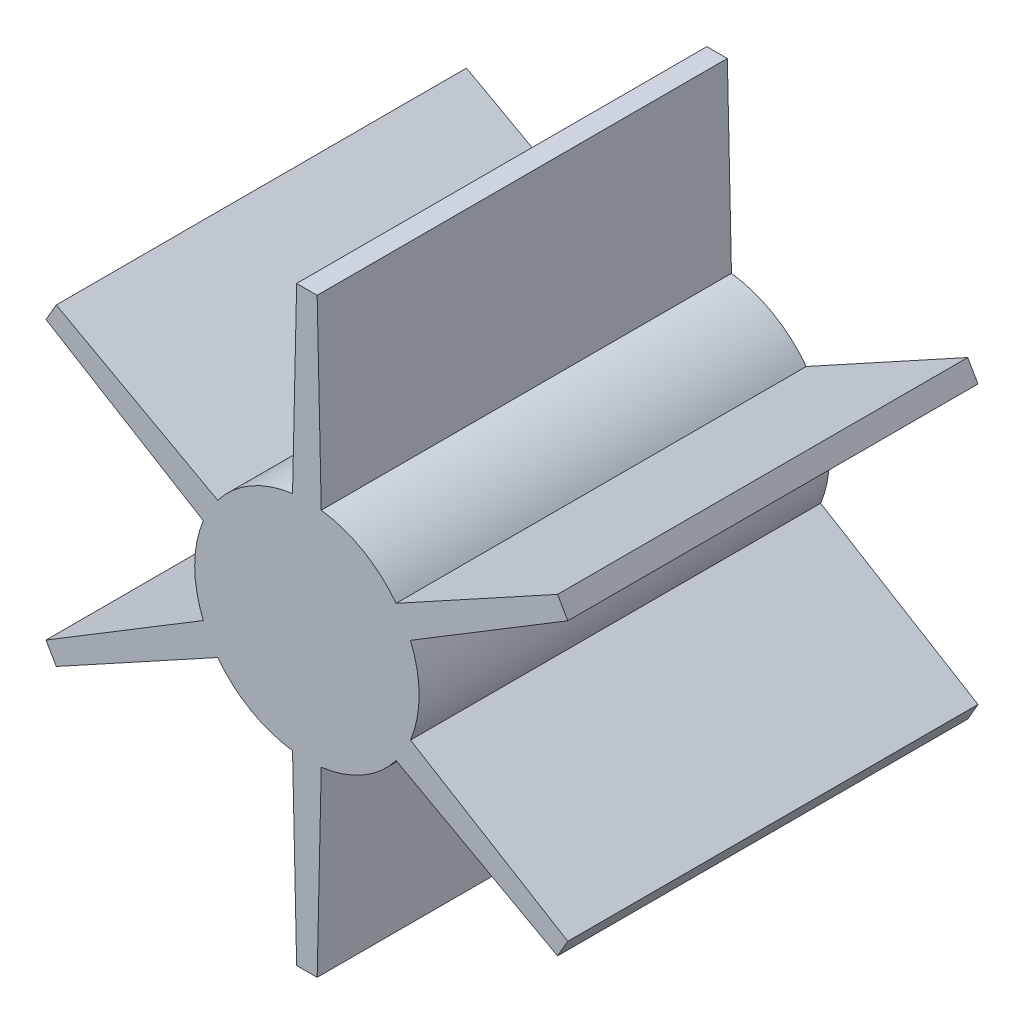
ISO-10303-21;
HEADER;
FILE_DESCRIPTION(('STEP AP214'),'2;1');
FILE_NAME('part.step','',(''),(''),'','','');
FILE_SCHEMA(('AUTOMOTIVE_DESIGN { 1 0 10303 214 1 1 1 1 }'));
ENDSEC;
DATA;
#1=APPLICATION_CONTEXT('core data for automotive mechanical design processes');
#2=APPLICATION_PROTOCOL_DEFINITION('international standard','automotive_design',2000,#1);
#3=PRODUCT_CONTEXT('',#1,'mechanical');
#4=PRODUCT('Part','Part','',(#3));
#5=PRODUCT_RELATED_PRODUCT_CATEGORY('part','',(#4));
#6=PRODUCT_DEFINITION_FORMATION('','',#4);
#7=PRODUCT_DEFINITION_CONTEXT('part definition',#1,'design');
#8=PRODUCT_DEFINITION('design','',#6,#7);
#9=PRODUCT_DEFINITION_SHAPE('','',#8);
#10=(LENGTH_UNIT() NAMED_UNIT(*) SI_UNIT(.MILLI.,.METRE.));
#11=(NAMED_UNIT(*) PLANE_ANGLE_UNIT() SI_UNIT($,.RADIAN.));
#12=(NAMED_UNIT(*) SI_UNIT($,.STERADIAN.) SOLID_ANGLE_UNIT());
#13=UNCERTAINTY_MEASURE_WITH_UNIT(LENGTH_MEASURE(1.E-05),#10,'distance_accuracy_value','');
#14=(GEOMETRIC_REPRESENTATION_CONTEXT(3) GLOBAL_UNCERTAINTY_ASSIGNED_CONTEXT((#13)) GLOBAL_UNIT_ASSIGNED_CONTEXT((#10,
#11,#12)) REPRESENTATION_CONTEXT('',''));
#15=CARTESIAN_POINT('',(0.,0.,0.));
#16=DIRECTION('',(0.,0.,1.));
#17=DIRECTION('',(1.,0.,0.));
#18=AXIS2_PLACEMENT_3D('',#15,#16,#17);
#19=CARTESIAN_POINT('',(0.,0.,100.));
#20=DIRECTION('',(0.,0.,-1.));
#21=DIRECTION('',(-1.,0.,0.));
#22=AXIS2_PLACEMENT_3D('',#19,#20,#21);
#23=CYLINDRICAL_SURFACE('',#22,27.3538290724796);
#24=CARTESIAN_POINT('',(0.,0.,0.));
#25=DIRECTION('',(0.,0.,1.));
#26=DIRECTION('',(1.,0.,0.));
#27=AXIS2_PLACEMENT_3D('',#24,#25,#26);
#28=CIRCLE('',#27,27.3538290724796);
#29=CARTESIAN_POINT('',(25.2443923882903,-10.5334048565765,0.));
#30=VERTEX_POINT('',#29);
#31=CARTESIAN_POINT('',(25.2443923882881,10.5334048565806,0.));
#32=VERTEX_POINT('',#31);
#33=EDGE_CURVE('E238',#30,#32,#28,.T.);
#34=ORIENTED_EDGE('',*,*,#33,.T.);
#35=DIRECTION('',(0.,0.,-1.));
#36=VECTOR('',#35,1.);
#37=CARTESIAN_POINT('',(25.2443923882881,10.5334048565806,100.));
#38=LINE('',#37,#36);
#39=CARTESIAN_POINT('',(25.2443923882881,10.5334048565806,100.));
#40=VERTEX_POINT('',#39);
#41=EDGE_CURVE('E11',#40,#32,#38,.T.);
#42=ORIENTED_EDGE('',*,*,#41,.F.);
#43=CARTESIAN_POINT('',(0.,0.,100.));
#44=DIRECTION('',(0.,0.,1.));
#45=DIRECTION('',(1.,0.,0.));
#46=AXIS2_PLACEMENT_3D('',#43,#44,#45);
#47=CIRCLE('',#46,27.3538290724796);
#48=CARTESIAN_POINT('',(25.2443923882903,-10.5334048565765,100.));
#49=VERTEX_POINT('',#48);
#50=EDGE_CURVE('E147',#49,#40,#47,.T.);
#51=ORIENTED_EDGE('',*,*,#50,.F.);
#52=DIRECTION('',(0.,0.,-1.));
#53=VECTOR('',#52,1.);
#54=CARTESIAN_POINT('',(25.2443923882903,-10.5334048565765,100.));
#55=LINE('',#54,#53);
#56=EDGE_CURVE('E237',#49,#30,#55,.T.);
#57=ORIENTED_EDGE('',*,*,#56,.T.);
#58=EDGE_LOOP('',(#34,#42,#51,#57));
#59=FACE_BOUND('',#58,.T.);
#60=ADVANCED_FACE('F43',(#59),#23,.T.);
#61=CARTESIAN_POINT('',(2.13046169462929,-3.50720767059468,100.));
#62=DIRECTION('',(0.519171418716483,-0.854670134021257,0.));
#63=DIRECTION('',(0.854670134021257,0.519171418716484,0.));
#64=AXIS2_PLACEMENT_3D('',#61,#62,#63);
#65=PLANE('',#64);
#66=DIRECTION('',(-0.854670134021257,-0.519171418716483,0.));
#67=VECTOR('',#66,1.);
#68=CARTESIAN_POINT('',(2.13046169462929,-3.50720767059468,0.));
#69=LINE('',#68,#67);
#70=CARTESIAN_POINT('',(63.6038290724812,33.8349364905411,0.));
#71=VERTEX_POINT('',#70);
#72=EDGE_CURVE('E241',#71,#32,#69,.T.);
#73=ORIENTED_EDGE('',*,*,#72,.F.);
#74=DIRECTION('',(0.,0.,-1.));
#75=VECTOR('',#74,1.);
#76=CARTESIAN_POINT('',(63.6038290724812,33.8349364905411,100.));
#77=LINE('',#76,#75);
#78=CARTESIAN_POINT('',(63.6038290724812,33.8349364905411,100.));
#79=VERTEX_POINT('',#78);
#80=EDGE_CURVE('E52',#79,#71,#77,.T.);
#81=ORIENTED_EDGE('',*,*,#80,.F.);
#82=DIRECTION('',(-0.854670134021257,-0.519171418716483,0.));
#83=VECTOR('',#82,1.);
#84=CARTESIAN_POINT('',(2.13046169462929,-3.50720767059468,100.));
#85=LINE('',#84,#83);
#86=EDGE_CURVE('E346',#79,#40,#85,.T.);
#87=ORIENTED_EDGE('',*,*,#86,.T.);
#88=ORIENTED_EDGE('',*,*,#41,.T.);
#89=EDGE_LOOP('',(#73,#81,#87,#88));
#90=FACE_BOUND('',#89,.T.);
#91=ADVANCED_FACE('F45',(#90),#65,.T.);
#92=CARTESIAN_POINT('',(62.3538290724818,36.0000000000012,100.));
#93=DIRECTION('',(-0.866025403784439,-0.499999999999999,0.));
#94=DIRECTION('',(0.499999999999999,-0.866025403784439,0.));
#95=AXIS2_PLACEMENT_3D('',#92,#93,#94);
#96=PLANE('',#95);
#97=DIRECTION('',(-0.499999999999999,0.866025403784439,0.));
#98=VECTOR('',#97,1.);
#99=CARTESIAN_POINT('',(62.3538290724818,36.0000000000012,0.));
#100=LINE('',#99,#98);
#101=CARTESIAN_POINT('',(61.1038290724812,38.1650635094633,0.));
#102=VERTEX_POINT('',#101);
#103=EDGE_CURVE('E246',#71,#102,#100,.T.);
#104=ORIENTED_EDGE('',*,*,#103,.T.);
#105=DIRECTION('',(0.,0.,-1.));
#106=VECTOR('',#105,1.);
#107=CARTESIAN_POINT('',(61.1038290724812,38.1650635094633,100.));
#108=LINE('',#107,#106);
#109=CARTESIAN_POINT('',(61.1038290724812,38.1650635094633,100.));
#110=VERTEX_POINT('',#109);
#111=EDGE_CURVE('E330',#110,#102,#108,.T.);
#112=ORIENTED_EDGE('',*,*,#111,.F.);
#113=DIRECTION('',(-0.499999999999999,0.866025403784439,0.));
#114=VECTOR('',#113,1.);
#115=CARTESIAN_POINT('',(62.3538290724818,36.0000000000012,100.));
#116=LINE('',#115,#114);
#117=EDGE_CURVE('E337',#79,#110,#116,.T.);
#118=ORIENTED_EDGE('',*,*,#117,.F.);
#119=ORIENTED_EDGE('',*,*,#80,.T.);
#120=EDGE_LOOP('',(#104,#112,#118,#119));
#121=FACE_BOUND('',#120,.T.);
#122=ADVANCED_FACE('F335',(#121),#96,.F.);
#123=CARTESIAN_POINT('',(-1.97210009176899,3.59863778463777,100.));
#124=DIRECTION('',(0.480580338560018,-0.876950704537911,0.));
#125=DIRECTION('',(0.876950704537911,0.480580338560018,0.));
#126=AXIS2_PLACEMENT_3D('',#123,#124,#125);
#127=PLANE('',#126);
#128=DIRECTION('',(-0.876950704537911,-0.480580338560018,0.));
#129=VECTOR('',#128,1.);
#130=CARTESIAN_POINT('',(-1.97210009176899,3.59863778463777,0.));
#131=LINE('',#130,#129);
#132=CARTESIAN_POINT('',(21.7443923882881,16.5955826830714,0.));
#133=VERTEX_POINT('',#132);
#134=EDGE_CURVE('E248',#102,#133,#131,.T.);
#135=ORIENTED_EDGE('',*,*,#134,.T.);
#136=DIRECTION('',(0.,0.,-1.));
#137=VECTOR('',#136,1.);
#138=CARTESIAN_POINT('',(21.7443923882881,16.5955826830714,100.));
#139=LINE('',#138,#137);
#140=CARTESIAN_POINT('',(21.7443923882881,16.5955826830714,100.));
#141=VERTEX_POINT('',#140);
#142=EDGE_CURVE('E327',#141,#133,#139,.T.);
#143=ORIENTED_EDGE('',*,*,#142,.F.);
#144=DIRECTION('',(-0.876950704537911,-0.480580338560018,0.));
#145=VECTOR('',#144,1.);
#146=CARTESIAN_POINT('',(-1.97210009176899,3.59863778463777,100.));
#147=LINE('',#146,#145);
#148=EDGE_CURVE('E385',#110,#141,#147,.T.);
#149=ORIENTED_EDGE('',*,*,#148,.F.);
#150=ORIENTED_EDGE('',*,*,#111,.T.);
#151=EDGE_LOOP('',(#135,#143,#149,#150));
#152=FACE_BOUND('',#151,.T.);
#153=ADVANCED_FACE('F467',(#152),#127,.F.);
#154=CARTESIAN_POINT('',(3.5,27.128987539649,0.));
#155=VERTEX_POINT('',#154);
#156=EDGE_CURVE('E243',#133,#155,#28,.T.);
#157=ORIENTED_EDGE('',*,*,#156,.T.);
#158=DIRECTION('',(0.,0.,-1.));
#159=VECTOR('',#158,1.);
#160=CARTESIAN_POINT('',(3.5,27.128987539649,100.));
#161=LINE('',#160,#159);
#162=CARTESIAN_POINT('',(3.5,27.128987539649,100.));
#163=VERTEX_POINT('',#162);
#164=EDGE_CURVE('E325',#163,#155,#161,.T.);
#165=ORIENTED_EDGE('',*,*,#164,.F.);
#166=EDGE_CURVE('E381',#141,#163,#47,.T.);
#167=ORIENTED_EDGE('',*,*,#166,.F.);
#168=ORIENTED_EDGE('',*,*,#142,.T.);
#169=EDGE_LOOP('',(#157,#165,#167,#168));
#170=FACE_BOUND('',#169,.T.);
#171=ADVANCED_FACE('F368',(#170),#23,.T.);
#172=CARTESIAN_POINT('',(4.10256178639826,0.0914301140412949,100.));
#173=DIRECTION('',(0.999751757276501,0.0222805705166538,0.));
#174=DIRECTION('',(-0.0222805705166538,0.999751757276501,0.));
#175=AXIS2_PLACEMENT_3D('',#172,#173,#174);
#176=PLANE('',#175);
#177=DIRECTION('',(0.0222805705166538,-0.999751757276501,0.));
#178=VECTOR('',#177,1.);
#179=CARTESIAN_POINT('',(4.10256178639826,0.0914301140412949,0.));
#180=LINE('',#179,#178);
#181=CARTESIAN_POINT('',(2.5,72.,0.));
#182=VERTEX_POINT('',#181);
#183=EDGE_CURVE('E250',#182,#155,#180,.T.);
#184=ORIENTED_EDGE('',*,*,#183,.F.);
#185=DIRECTION('',(0.,0.,-1.));
#186=VECTOR('',#185,1.);
#187=CARTESIAN_POINT('',(2.5,72.,100.));
#188=LINE('',#187,#186);
#189=CARTESIAN_POINT('',(2.5,72.,100.));
#190=VERTEX_POINT('',#189);
#191=EDGE_CURVE('E323',#190,#182,#188,.T.);
#192=ORIENTED_EDGE('',*,*,#191,.F.);
#193=DIRECTION('',(0.0222805705166538,-0.999751757276501,0.));
#194=VECTOR('',#193,1.);
#195=CARTESIAN_POINT('',(4.10256178639826,0.0914301140412949,100.));
#196=LINE('',#195,#194);
#197=EDGE_CURVE('E379',#190,#163,#196,.T.);
#198=ORIENTED_EDGE('',*,*,#197,.T.);
#199=ORIENTED_EDGE('',*,*,#164,.T.);
#200=EDGE_LOOP('',(#184,#192,#198,#199));
#201=FACE_BOUND('',#200,.T.);
#202=ADVANCED_FACE('F376',(#201),#176,.T.);
#203=CARTESIAN_POINT('',(0.,72.,100.));
#204=DIRECTION('',(0.,-1.,0.));
#205=DIRECTION('',(0.,0.,-1.));
#206=AXIS2_PLACEMENT_3D('',#203,#204,#205);
#207=PLANE('',#206);
#208=DIRECTION('',(-1.,0.,0.));
#209=VECTOR('',#208,1.);
#210=CARTESIAN_POINT('',(0.,72.,0.));
#211=LINE('',#210,#209);
#212=CARTESIAN_POINT('',(-2.5,72.,0.));
#213=VERTEX_POINT('',#212);
#214=EDGE_CURVE('E253',#182,#213,#211,.T.);
#215=ORIENTED_EDGE('',*,*,#214,.T.);
#216=DIRECTION('',(0.,0.,-1.));
#217=VECTOR('',#216,1.);
#218=CARTESIAN_POINT('',(-2.5,72.,100.));
#219=LINE('',#218,#217);
#220=CARTESIAN_POINT('',(-2.5,72.,100.));
#221=VERTEX_POINT('',#220);
#222=EDGE_CURVE('E320',#221,#213,#219,.T.);
#223=ORIENTED_EDGE('',*,*,#222,.F.);
#224=DIRECTION('',(-1.,0.,0.));
#225=VECTOR('',#224,1.);
#226=CARTESIAN_POINT('',(0.,72.,100.));
#227=LINE('',#226,#225);
#228=EDGE_CURVE('E380',#190,#221,#227,.T.);
#229=ORIENTED_EDGE('',*,*,#228,.F.);
#230=ORIENTED_EDGE('',*,*,#191,.T.);
#231=EDGE_LOOP('',(#215,#223,#229,#230));
#232=FACE_BOUND('',#231,.T.);
#233=ADVANCED_FACE('F463',(#232),#207,.F.);
#234=CARTESIAN_POINT('',(-4.10256178639826,0.091430114041295,100.));
#235=DIRECTION('',(0.999751757276501,-0.0222805705166538,0.));
#236=DIRECTION('',(0.0222805705166538,0.999751757276501,0.));
#237=AXIS2_PLACEMENT_3D('',#234,#235,#236);
#238=PLANE('',#237);
#239=DIRECTION('',(-0.0222805705166538,-0.999751757276501,0.));
#240=VECTOR('',#239,1.);
#241=CARTESIAN_POINT('',(-4.10256178639826,0.091430114041295,0.));
#242=LINE('',#241,#240);
#243=CARTESIAN_POINT('',(-3.5,27.128987539649,0.));
#244=VERTEX_POINT('',#243);
#245=EDGE_CURVE('E255',#213,#244,#242,.T.);
#246=ORIENTED_EDGE('',*,*,#245,.T.);
#247=DIRECTION('',(0.,0.,-1.));
#248=VECTOR('',#247,1.);
#249=CARTESIAN_POINT('',(-3.5,27.128987539649,100.));
#250=LINE('',#249,#248);
#251=CARTESIAN_POINT('',(-3.5,27.128987539649,100.));
#252=VERTEX_POINT('',#251);
#253=EDGE_CURVE('E317',#252,#244,#250,.T.);
#254=ORIENTED_EDGE('',*,*,#253,.F.);
#255=DIRECTION('',(-0.0222805705166538,-0.999751757276501,0.));
#256=VECTOR('',#255,1.);
#257=CARTESIAN_POINT('',(-4.10256178639826,0.091430114041295,100.));
#258=LINE('',#257,#256);
#259=EDGE_CURVE('E383',#221,#252,#258,.T.);
#260=ORIENTED_EDGE('',*,*,#259,.F.);
#261=ORIENTED_EDGE('',*,*,#222,.T.);
#262=EDGE_LOOP('',(#246,#254,#260,#261));
#263=FACE_BOUND('',#262,.T.);
#264=ADVANCED_FACE('F456',(#263),#238,.F.);
#265=CARTESIAN_POINT('',(-21.7443923882874,16.5955826830682,0.));
#266=VERTEX_POINT('',#265);
#267=EDGE_CURVE('E257',#244,#266,#28,.T.);
#268=ORIENTED_EDGE('',*,*,#267,.T.);
#269=DIRECTION('',(0.,0.,-1.));
#270=VECTOR('',#269,1.);
#271=CARTESIAN_POINT('',(-21.7443923882874,16.5955826830682,100.));
#272=LINE('',#271,#270);
#273=CARTESIAN_POINT('',(-21.7443923882874,16.5955826830682,100.));
#274=VERTEX_POINT('',#273);
#275=EDGE_CURVE('E315',#274,#266,#272,.T.);
#276=ORIENTED_EDGE('',*,*,#275,.F.);
#277=EDGE_CURVE('E386',#252,#274,#47,.T.);
#278=ORIENTED_EDGE('',*,*,#277,.F.);
#279=ORIENTED_EDGE('',*,*,#253,.T.);
#280=EDGE_LOOP('',(#268,#276,#278,#279));
#281=FACE_BOUND('',#280,.T.);
#282=ADVANCED_FACE('F444',(#281),#23,.T.);
#283=CARTESIAN_POINT('',(1.97210009176764,3.59863778463531,100.));
#284=DIRECTION('',(0.480580338560017,0.876950704537911,0.));
#285=DIRECTION('',(-0.876950704537911,0.480580338560017,0.));
#286=AXIS2_PLACEMENT_3D('',#283,#284,#285);
#287=PLANE('',#286);
#288=DIRECTION('',(0.876950704537911,-0.480580338560017,0.));
#289=VECTOR('',#288,1.);
#290=CARTESIAN_POINT('',(1.97210009176764,3.59863778463531,0.));
#291=LINE('',#290,#289);
#292=CARTESIAN_POINT('',(-61.1038290724786,38.1650635094585,0.));
#293=VERTEX_POINT('',#292);
#294=EDGE_CURVE('E258',#293,#266,#291,.T.);
#295=ORIENTED_EDGE('',*,*,#294,.F.);
#296=DIRECTION('',(0.,0.,-1.));
#297=VECTOR('',#296,1.);
#298=CARTESIAN_POINT('',(-61.1038290724786,38.1650635094585,100.));
#299=LINE('',#298,#297);
#300=CARTESIAN_POINT('',(-61.1038290724786,38.1650635094585,100.));
#301=VERTEX_POINT('',#300);
#302=EDGE_CURVE('E313',#301,#293,#299,.T.);
#303=ORIENTED_EDGE('',*,*,#302,.F.);
#304=DIRECTION('',(0.876950704537911,-0.480580338560017,0.));
#305=VECTOR('',#304,1.);
#306=CARTESIAN_POINT('',(1.97210009176764,3.59863778463531,100.));
#307=LINE('',#306,#305);
#308=EDGE_CURVE('E391',#301,#274,#307,.T.);
#309=ORIENTED_EDGE('',*,*,#308,.T.);
#310=ORIENTED_EDGE('',*,*,#275,.T.);
#311=EDGE_LOOP('',(#295,#303,#309,#310));
#312=FACE_BOUND('',#311,.T.);
#313=ADVANCED_FACE('F455',(#312),#287,.T.);
#314=CARTESIAN_POINT('',(-62.3538290724777,35.999999999999,100.));
#315=DIRECTION('',(0.866025403784438,-0.500000000000001,0.));
#316=DIRECTION('',(0.500000000000001,0.866025403784438,0.));
#317=AXIS2_PLACEMENT_3D('',#314,#315,#316);
#318=PLANE('',#317);
#319=DIRECTION('',(-0.500000000000001,-0.866025403784438,0.));
#320=VECTOR('',#319,1.);
#321=CARTESIAN_POINT('',(-62.3538290724777,35.999999999999,0.));
#322=LINE('',#321,#320);
#323=CARTESIAN_POINT('',(-63.6038290724786,33.8349364905363,0.));
#324=VERTEX_POINT('',#323);
#325=EDGE_CURVE('E261',#293,#324,#322,.T.);
#326=ORIENTED_EDGE('',*,*,#325,.T.);
#327=DIRECTION('',(0.,0.,-1.));
#328=VECTOR('',#327,1.);
#329=CARTESIAN_POINT('',(-63.6038290724786,33.8349364905363,100.));
#330=LINE('',#329,#328);
#331=CARTESIAN_POINT('',(-63.6038290724786,33.8349364905363,100.));
#332=VERTEX_POINT('',#331);
#333=EDGE_CURVE('E310',#332,#324,#330,.T.);
#334=ORIENTED_EDGE('',*,*,#333,.F.);
#335=DIRECTION('',(-0.500000000000001,-0.866025403784438,0.));
#336=VECTOR('',#335,1.);
#337=CARTESIAN_POINT('',(-62.3538290724777,35.999999999999,100.));
#338=LINE('',#337,#336);
#339=EDGE_CURVE('E394',#301,#332,#338,.T.);
#340=ORIENTED_EDGE('',*,*,#339,.F.);
#341=ORIENTED_EDGE('',*,*,#302,.T.);
#342=EDGE_LOOP('',(#326,#334,#340,#341));
#343=FACE_BOUND('',#342,.T.);
#344=ADVANCED_FACE('F451',(#343),#318,.F.);
#345=CARTESIAN_POINT('',(-2.13046169463062,-3.50720767059687,100.));
#346=DIRECTION('',(0.519171418716482,0.854670134021258,0.));
#347=DIRECTION('',(-0.854670134021258,0.519171418716482,0.));
#348=AXIS2_PLACEMENT_3D('',#345,#346,#347);
#349=PLANE('',#348);
#350=DIRECTION('',(0.854670134021258,-0.519171418716483,0.));
#351=VECTOR('',#350,1.);
#352=CARTESIAN_POINT('',(-2.13046169463062,-3.50720767059687,0.));
#353=LINE('',#352,#351);
#354=CARTESIAN_POINT('',(-25.2443923882874,10.5334048565768,0.));
#355=VERTEX_POINT('',#354);
#356=EDGE_CURVE('E263',#324,#355,#353,.T.);
#357=ORIENTED_EDGE('',*,*,#356,.T.);
#358=DIRECTION('',(0.,0.,-1.));
#359=VECTOR('',#358,1.);
#360=CARTESIAN_POINT('',(-25.2443923882874,10.5334048565768,100.));
#361=LINE('',#360,#359);
#362=CARTESIAN_POINT('',(-25.2443923882874,10.5334048565768,100.));
#363=VERTEX_POINT('',#362);
#364=EDGE_CURVE('E307',#363,#355,#361,.T.);
#365=ORIENTED_EDGE('',*,*,#364,.F.);
#366=DIRECTION('',(0.854670134021258,-0.519171418716483,0.));
#367=VECTOR('',#366,1.);
#368=CARTESIAN_POINT('',(-2.13046169463062,-3.50720767059687,100.));
#369=LINE('',#368,#367);
#370=EDGE_CURVE('E396',#332,#363,#369,.T.);
#371=ORIENTED_EDGE('',*,*,#370,.F.);
#372=ORIENTED_EDGE('',*,*,#333,.T.);
#373=EDGE_LOOP('',(#357,#365,#371,#372));
#374=FACE_BOUND('',#373,.T.);
#375=ADVANCED_FACE('F443',(#374),#349,.F.);
#376=CARTESIAN_POINT('',(-25.2443923882849,-10.5334048565823,0.));
#377=VERTEX_POINT('',#376);
#378=EDGE_CURVE('E265',#355,#377,#28,.T.);
#379=ORIENTED_EDGE('',*,*,#378,.T.);
#380=DIRECTION('',(0.,0.,-1.));
#381=VECTOR('',#380,1.);
#382=CARTESIAN_POINT('',(-25.2443923882849,-10.5334048565823,100.));
#383=LINE('',#382,#381);
#384=CARTESIAN_POINT('',(-25.2443923882849,-10.5334048565823,100.));
#385=VERTEX_POINT('',#384);
#386=EDGE_CURVE('E305',#385,#377,#383,.T.);
#387=ORIENTED_EDGE('',*,*,#386,.F.);
#388=EDGE_CURVE('E398',#363,#385,#47,.T.);
#389=ORIENTED_EDGE('',*,*,#388,.F.);
#390=ORIENTED_EDGE('',*,*,#364,.T.);
#391=EDGE_LOOP('',(#379,#387,#389,#390));
#392=FACE_BOUND('',#391,.T.);
#393=ADVANCED_FACE('F431',(#392),#23,.T.);
#394=CARTESIAN_POINT('',(-2.13046169462753,3.50720767059178,100.));
#395=DIRECTION('',(-0.519171418716484,0.854670134021257,0.));
#396=DIRECTION('',(-0.854670134021257,-0.519171418716484,0.));
#397=AXIS2_PLACEMENT_3D('',#394,#395,#396);
#398=PLANE('',#397);
#399=DIRECTION('',(0.854670134021257,0.519171418716484,0.));
#400=VECTOR('',#399,1.);
#401=CARTESIAN_POINT('',(-2.13046169462753,3.50720767059178,0.));
#402=LINE('',#401,#400);
#403=CARTESIAN_POINT('',(-63.6038290724758,-33.8349364905418,0.));
#404=VERTEX_POINT('',#403);
#405=EDGE_CURVE('E266',#404,#377,#402,.T.);
#406=ORIENTED_EDGE('',*,*,#405,.F.);
#407=DIRECTION('',(0.,0.,-1.));
#408=VECTOR('',#407,1.);
#409=CARTESIAN_POINT('',(-63.6038290724758,-33.8349364905418,100.));
#410=LINE('',#409,#408);
#411=CARTESIAN_POINT('',(-63.6038290724758,-33.8349364905418,100.));
#412=VERTEX_POINT('',#411);
#413=EDGE_CURVE('E303',#412,#404,#410,.T.);
#414=ORIENTED_EDGE('',*,*,#413,.F.);
#415=DIRECTION('',(0.854670134021257,0.519171418716484,0.));
#416=VECTOR('',#415,1.);
#417=CARTESIAN_POINT('',(-2.13046169462753,3.50720767059178,100.));
#418=LINE('',#417,#416);
#419=EDGE_CURVE('E399',#412,#385,#418,.T.);
#420=ORIENTED_EDGE('',*,*,#419,.T.);
#421=ORIENTED_EDGE('',*,*,#386,.T.);
#422=EDGE_LOOP('',(#406,#414,#420,#421));
#423=FACE_BOUND('',#422,.T.);
#424=ADVANCED_FACE('F442',(#423),#398,.T.);
#425=CARTESIAN_POINT('',(-62.353829072478,-35.9999999999992,100.));
#426=DIRECTION('',(0.866025403784438,0.500000000000001,0.));
#427=DIRECTION('',(-0.500000000000001,0.866025403784438,0.));
#428=AXIS2_PLACEMENT_3D('',#425,#426,#427);
#429=PLANE('',#428);
#430=DIRECTION('',(0.500000000000001,-0.866025403784438,0.));
#431=VECTOR('',#430,1.);
#432=CARTESIAN_POINT('',(-62.353829072478,-35.9999999999992,0.));
#433=LINE('',#432,#431);
#434=CARTESIAN_POINT('',(-61.1038290724759,-38.165063509464,0.));
#435=VERTEX_POINT('',#434);
#436=EDGE_CURVE('E269',#404,#435,#433,.T.);
#437=ORIENTED_EDGE('',*,*,#436,.T.);
#438=DIRECTION('',(0.,0.,-1.));
#439=VECTOR('',#438,1.);
#440=CARTESIAN_POINT('',(-61.1038290724759,-38.165063509464,100.));
#441=LINE('',#440,#439);
#442=CARTESIAN_POINT('',(-61.1038290724759,-38.165063509464,100.));
#443=VERTEX_POINT('',#442);
#444=EDGE_CURVE('E300',#443,#435,#441,.T.);
#445=ORIENTED_EDGE('',*,*,#444,.F.);
#446=DIRECTION('',(0.500000000000001,-0.866025403784438,0.));
#447=VECTOR('',#446,1.);
#448=CARTESIAN_POINT('',(-62.353829072478,-35.9999999999992,100.));
#449=LINE('',#448,#447);
#450=EDGE_CURVE('E402',#412,#443,#449,.T.);
#451=ORIENTED_EDGE('',*,*,#450,.F.);
#452=ORIENTED_EDGE('',*,*,#413,.T.);
#453=EDGE_LOOP('',(#437,#445,#451,#452));
#454=FACE_BOUND('',#453,.T.);
#455=ADVANCED_FACE('F438',(#454),#429,.F.);
#456=CARTESIAN_POINT('',(1.97210009177053,-3.59863778464058,100.));
#457=DIRECTION('',(-0.480580338560018,0.876950704537911,0.));
#458=DIRECTION('',(-0.876950704537911,-0.480580338560018,0.));
#459=AXIS2_PLACEMENT_3D('',#456,#457,#458);
#460=PLANE('',#459);
#461=DIRECTION('',(0.876950704537911,0.480580338560018,0.));
#462=VECTOR('',#461,1.);
#463=CARTESIAN_POINT('',(1.97210009177053,-3.59863778464058,0.));
#464=LINE('',#463,#462);
#465=CARTESIAN_POINT('',(-21.7443923882843,-16.5955826830733,0.));
#466=VERTEX_POINT('',#465);
#467=EDGE_CURVE('E271',#435,#466,#464,.T.);
#468=ORIENTED_EDGE('',*,*,#467,.T.);
#469=DIRECTION('',(0.,0.,-1.));
#470=VECTOR('',#469,1.);
#471=CARTESIAN_POINT('',(-21.7443923882843,-16.5955826830733,100.));
#472=LINE('',#471,#470);
#473=CARTESIAN_POINT('',(-21.7443923882843,-16.5955826830733,100.));
#474=VERTEX_POINT('',#473);
#475=EDGE_CURVE('E297',#474,#466,#472,.T.);
#476=ORIENTED_EDGE('',*,*,#475,.F.);
#477=DIRECTION('',(0.876950704537911,0.480580338560018,0.));
#478=VECTOR('',#477,1.);
#479=CARTESIAN_POINT('',(1.97210009177053,-3.59863778464058,100.));
#480=LINE('',#479,#478);
#481=EDGE_CURVE('E404',#443,#474,#480,.T.);
#482=ORIENTED_EDGE('',*,*,#481,.F.);
#483=ORIENTED_EDGE('',*,*,#444,.T.);
#484=EDGE_LOOP('',(#468,#476,#482,#483));
#485=FACE_BOUND('',#484,.T.);
#486=ADVANCED_FACE('F430',(#485),#460,.F.);
#487=CARTESIAN_POINT('',(-3.49999999999463,-27.1289875396497,0.));
#488=VERTEX_POINT('',#487);
#489=EDGE_CURVE('E273',#466,#488,#28,.T.);
#490=ORIENTED_EDGE('',*,*,#489,.T.);
#491=DIRECTION('',(0.,0.,-1.));
#492=VECTOR('',#491,1.);
#493=CARTESIAN_POINT('',(-3.49999999999463,-27.1289875396497,100.));
#494=LINE('',#493,#492);
#495=CARTESIAN_POINT('',(-3.49999999999463,-27.1289875396497,100.));
#496=VERTEX_POINT('',#495);
#497=EDGE_CURVE('E295',#496,#488,#494,.T.);
#498=ORIENTED_EDGE('',*,*,#497,.F.);
#499=EDGE_CURVE('E232',#474,#496,#47,.T.);
#500=ORIENTED_EDGE('',*,*,#499,.F.);
#501=ORIENTED_EDGE('',*,*,#475,.T.);
#502=EDGE_LOOP('',(#490,#498,#500,#501));
#503=FACE_BOUND('',#502,.T.);
#504=ADVANCED_FACE('F419',(#503),#23,.T.);
#505=CARTESIAN_POINT('',(-4.10256178639291,-0.0914301140411761,100.));
#506=DIRECTION('',(-0.999751757276501,-0.0222805705166539,0.));
#507=DIRECTION('',(0.0222805705166539,-0.999751757276501,0.));
#508=AXIS2_PLACEMENT_3D('',#505,#506,#507);
#509=PLANE('',#508);
#510=DIRECTION('',(-0.0222805705166539,0.999751757276501,0.));
#511=VECTOR('',#510,1.);
#512=CARTESIAN_POINT('',(-4.10256178639291,-0.0914301140411761,0.));
#513=LINE('',#512,#511);
#514=CARTESIAN_POINT('',(-2.49999999999462,-72.0000000000007,0.));
#515=VERTEX_POINT('',#514);
#516=EDGE_CURVE('E274',#515,#488,#513,.T.);
#517=ORIENTED_EDGE('',*,*,#516,.F.);
#518=DIRECTION('',(0.,0.,-1.));
#519=VECTOR('',#518,1.);
#520=CARTESIAN_POINT('',(-2.49999999999462,-72.0000000000007,100.));
#521=LINE('',#520,#519);
#522=CARTESIAN_POINT('',(-2.49999999999462,-72.0000000000007,100.));
#523=VERTEX_POINT('',#522);
#524=EDGE_CURVE('E293',#523,#515,#521,.T.);
#525=ORIENTED_EDGE('',*,*,#524,.F.);
#526=DIRECTION('',(-0.0222805705166539,0.999751757276501,0.));
#527=VECTOR('',#526,1.);
#528=CARTESIAN_POINT('',(-4.10256178639291,-0.0914301140411761,100.));
#529=LINE('',#528,#527);
#530=EDGE_CURVE('E406',#523,#496,#529,.T.);
#531=ORIENTED_EDGE('',*,*,#530,.T.);
#532=ORIENTED_EDGE('',*,*,#497,.T.);
#533=EDGE_LOOP('',(#517,#525,#531,#532));
#534=FACE_BOUND('',#533,.T.);
#535=ADVANCED_FACE('F429',(#534),#509,.T.);
#536=CARTESIAN_POINT('',(0.,-72.0000000000007,100.));
#537=DIRECTION('',(0.,1.,0.));
#538=DIRECTION('',(0.,0.,1.));
#539=AXIS2_PLACEMENT_3D('',#536,#537,#538);
#540=PLANE('',#539);
#541=DIRECTION('',(1.,0.,0.));
#542=VECTOR('',#541,1.);
#543=CARTESIAN_POINT('',(0.,-72.0000000000007,0.));
#544=LINE('',#543,#542);
#545=CARTESIAN_POINT('',(2.50000000000538,-72.0000000000007,0.));
#546=VERTEX_POINT('',#545);
#547=EDGE_CURVE('E277',#515,#546,#544,.T.);
#548=ORIENTED_EDGE('',*,*,#547,.T.);
#549=DIRECTION('',(0.,0.,-1.));
#550=VECTOR('',#549,1.);
#551=CARTESIAN_POINT('',(2.50000000000538,-72.0000000000007,100.));
#552=LINE('',#551,#550);
#553=CARTESIAN_POINT('',(2.50000000000538,-72.0000000000007,100.));
#554=VERTEX_POINT('',#553);
#555=EDGE_CURVE('E290',#554,#546,#552,.T.);
#556=ORIENTED_EDGE('',*,*,#555,.F.);
#557=DIRECTION('',(1.,0.,0.));
#558=VECTOR('',#557,1.);
#559=CARTESIAN_POINT('',(0.,-72.0000000000007,100.));
#560=LINE('',#559,#558);
#561=EDGE_CURVE('E408',#523,#554,#560,.T.);
#562=ORIENTED_EDGE('',*,*,#561,.F.);
#563=ORIENTED_EDGE('',*,*,#524,.T.);
#564=EDGE_LOOP('',(#548,#556,#562,#563));
#565=FACE_BOUND('',#564,.T.);
#566=ADVANCED_FACE('F425',(#565),#540,.F.);
#567=CARTESIAN_POINT('',(4.10256178640364,-0.0914301140414144,100.));
#568=DIRECTION('',(-0.999751757276501,0.0222805705166537,0.));
#569=DIRECTION('',(-0.0222805705166537,-0.999751757276501,0.));
#570=AXIS2_PLACEMENT_3D('',#567,#568,#569);
#571=PLANE('',#570);
#572=DIRECTION('',(0.0222805705166537,0.999751757276501,0.));
#573=VECTOR('',#572,1.);
#574=CARTESIAN_POINT('',(4.10256178640364,-0.0914301140414144,0.));
#575=LINE('',#574,#573);
#576=CARTESIAN_POINT('',(3.50000000000528,-27.128987539649,0.));
#577=VERTEX_POINT('',#576);
#578=EDGE_CURVE('E279',#546,#577,#575,.T.);
#579=ORIENTED_EDGE('',*,*,#578,.T.);
#580=DIRECTION('',(0.,0.,-1.));
#581=VECTOR('',#580,1.);
#582=CARTESIAN_POINT('',(3.50000000000528,-27.128987539649,100.));
#583=LINE('',#582,#581);
#584=CARTESIAN_POINT('',(3.50000000000528,-27.128987539649,100.));
#585=VERTEX_POINT('',#584);
#586=EDGE_CURVE('E287',#585,#577,#583,.T.);
#587=ORIENTED_EDGE('',*,*,#586,.F.);
#588=DIRECTION('',(0.0222805705166537,0.999751757276501,0.));
#589=VECTOR('',#588,1.);
#590=CARTESIAN_POINT('',(4.10256178640364,-0.0914301140414144,100.));
#591=LINE('',#590,#589);
#592=EDGE_CURVE('E230',#554,#585,#591,.T.);
#593=ORIENTED_EDGE('',*,*,#592,.F.);
#594=ORIENTED_EDGE('',*,*,#555,.T.);
#595=EDGE_LOOP('',(#579,#587,#593,#594));
#596=FACE_BOUND('',#595,.T.);
#597=ADVANCED_FACE('F415',(#596),#571,.F.);
#598=CARTESIAN_POINT('',(21.7443923882909,-16.5955826830675,0.));
#599=VERTEX_POINT('',#598);
#600=EDGE_CURVE('E242',#577,#599,#28,.T.);
#601=ORIENTED_EDGE('',*,*,#600,.T.);
#602=DIRECTION('',(0.,0.,-1.));
#603=VECTOR('',#602,1.);
#604=CARTESIAN_POINT('',(21.7443923882909,-16.5955826830675,100.));
#605=LINE('',#604,#603);
#606=CARTESIAN_POINT('',(21.7443923882909,-16.5955826830675,100.));
#607=VERTEX_POINT('',#606);
#608=EDGE_CURVE('E219',#607,#599,#605,.T.);
#609=ORIENTED_EDGE('',*,*,#608,.F.);
#610=EDGE_CURVE('E227',#585,#607,#47,.T.);
#611=ORIENTED_EDGE('',*,*,#610,.F.);
#612=ORIENTED_EDGE('',*,*,#586,.T.);
#613=EDGE_LOOP('',(#601,#609,#611,#612));
#614=FACE_BOUND('',#613,.T.);
#615=ADVANCED_FACE('F416',(#614),#23,.T.);
#616=CARTESIAN_POINT('',(-1.9721000917667,-3.5986377846336,100.));
#617=DIRECTION('',(-0.480580338560018,-0.876950704537911,0.));
#618=DIRECTION('',(0.876950704537911,-0.480580338560018,0.));
#619=AXIS2_PLACEMENT_3D('',#616,#617,#618);
#620=PLANE('',#619);
#621=DIRECTION('',(-0.876950704537911,0.480580338560018,0.));
#622=VECTOR('',#621,1.);
#623=CARTESIAN_POINT('',(-1.9721000917667,-3.5986377846336,0.));
#624=LINE('',#623,#622);
#625=CARTESIAN_POINT('',(61.103829072484,-38.1650635094593,0.));
#626=VERTEX_POINT('',#625);
#627=EDGE_CURVE('E218',#626,#599,#624,.T.);
#628=ORIENTED_EDGE('',*,*,#627,.F.);
#629=DIRECTION('',(0.,0.,-1.));
#630=VECTOR('',#629,1.);
#631=CARTESIAN_POINT('',(61.103829072484,-38.1650635094593,100.));
#632=LINE('',#631,#630);
#633=CARTESIAN_POINT('',(61.103829072484,-38.1650635094593,100.));
#634=VERTEX_POINT('',#633);
#635=EDGE_CURVE('E212',#634,#626,#632,.T.);
#636=ORIENTED_EDGE('',*,*,#635,.F.);
#637=DIRECTION('',(-0.876950704537911,0.480580338560018,0.));
#638=VECTOR('',#637,1.);
#639=CARTESIAN_POINT('',(-1.9721000917667,-3.5986377846336,100.));
#640=LINE('',#639,#638);
#641=EDGE_CURVE('E216',#634,#607,#640,.T.);
#642=ORIENTED_EDGE('',*,*,#641,.T.);
#643=ORIENTED_EDGE('',*,*,#608,.T.);
#644=EDGE_LOOP('',(#628,#636,#642,#643));
#645=FACE_BOUND('',#644,.T.);
#646=ADVANCED_FACE('F214',(#645),#620,.T.);
#647=CARTESIAN_POINT('',(62.353829072482,-36.0000000000015,100.));
#648=DIRECTION('',(-0.866025403784438,0.500000000000001,0.));
#649=DIRECTION('',(-0.500000000000001,-0.866025403784438,0.));
#650=AXIS2_PLACEMENT_3D('',#647,#648,#649);
#651=PLANE('',#650);
#652=DIRECTION('',(0.500000000000001,0.866025403784438,0.));
#653=VECTOR('',#652,1.);
#654=CARTESIAN_POINT('',(62.353829072482,-36.0000000000015,0.));
#655=LINE('',#654,#653);
#656=CARTESIAN_POINT('',(63.6038290724839,-33.8349364905371,0.));
#657=VERTEX_POINT('',#656);
#658=EDGE_CURVE('E135',#626,#657,#655,.T.);
#659=ORIENTED_EDGE('',*,*,#658,.T.);
#660=DIRECTION('',(0.,0.,-1.));
#661=VECTOR('',#660,1.);
#662=CARTESIAN_POINT('',(63.6038290724839,-33.8349364905371,100.));
#663=LINE('',#662,#661);
#664=CARTESIAN_POINT('',(63.6038290724839,-33.8349364905371,100.));
#665=VERTEX_POINT('',#664);
#666=EDGE_CURVE('E220',#665,#657,#663,.T.);
#667=ORIENTED_EDGE('',*,*,#666,.F.);
#668=DIRECTION('',(0.500000000000001,0.866025403784438,0.));
#669=VECTOR('',#668,1.);
#670=CARTESIAN_POINT('',(62.353829072482,-36.0000000000015,100.));
#671=LINE('',#670,#669);
#672=EDGE_CURVE('E222',#634,#665,#671,.T.);
#673=ORIENTED_EDGE('',*,*,#672,.F.);
#674=ORIENTED_EDGE('',*,*,#635,.T.);
#675=EDGE_LOOP('',(#659,#667,#673,#674));
#676=FACE_BOUND('',#675,.T.);
#677=ADVANCED_FACE('F223',(#676),#651,.F.);
#678=CARTESIAN_POINT('',(2.13046169463176,3.50720767059875,100.));
#679=DIRECTION('',(-0.519171418716483,-0.854670134021257,0.));
#680=DIRECTION('',(0.854670134021257,-0.519171418716483,0.));
#681=AXIS2_PLACEMENT_3D('',#678,#679,#680);
#682=PLANE('',#681);
#683=DIRECTION('',(-0.854670134021257,0.519171418716483,0.));
#684=VECTOR('',#683,1.);
#685=CARTESIAN_POINT('',(2.13046169463176,3.50720767059875,0.));
#686=LINE('',#685,#684);
#687=EDGE_CURVE('E141',#657,#30,#686,.T.);
#688=ORIENTED_EDGE('',*,*,#687,.T.);
#689=ORIENTED_EDGE('',*,*,#56,.F.);
#690=DIRECTION('',(-0.854670134021257,0.519171418716483,0.));
#691=VECTOR('',#690,1.);
#692=CARTESIAN_POINT('',(2.13046169463176,3.50720767059875,100.));
#693=LINE('',#692,#691);
#694=EDGE_CURVE('E60',#665,#49,#693,.T.);
#695=ORIENTED_EDGE('',*,*,#694,.F.);
#696=ORIENTED_EDGE('',*,*,#666,.T.);
#697=EDGE_LOOP('',(#688,#689,#695,#696));
#698=FACE_BOUND('',#697,.T.);
#699=ADVANCED_FACE('F542',(#698),#682,.F.);
#700=CARTESIAN_POINT('',(0.,0.,100.));
#701=DIRECTION('',(0.,0.,1.));
#702=DIRECTION('',(1.,0.,0.));
#703=AXIS2_PLACEMENT_3D('',#700,#701,#702);
#704=PLANE('',#703);
#705=ORIENTED_EDGE('',*,*,#50,.T.);
#706=ORIENTED_EDGE('',*,*,#86,.F.);
#707=ORIENTED_EDGE('',*,*,#117,.T.);
#708=ORIENTED_EDGE('',*,*,#148,.T.);
#709=ORIENTED_EDGE('',*,*,#166,.T.);
#710=ORIENTED_EDGE('',*,*,#197,.F.);
#711=ORIENTED_EDGE('',*,*,#228,.T.);
#712=ORIENTED_EDGE('',*,*,#259,.T.);
#713=ORIENTED_EDGE('',*,*,#277,.T.);
#714=ORIENTED_EDGE('',*,*,#308,.F.);
#715=ORIENTED_EDGE('',*,*,#339,.T.);
#716=ORIENTED_EDGE('',*,*,#370,.T.);
#717=ORIENTED_EDGE('',*,*,#388,.T.);
#718=ORIENTED_EDGE('',*,*,#419,.F.);
#719=ORIENTED_EDGE('',*,*,#450,.T.);
#720=ORIENTED_EDGE('',*,*,#481,.T.);
#721=ORIENTED_EDGE('',*,*,#499,.T.);
#722=ORIENTED_EDGE('',*,*,#530,.F.);
#723=ORIENTED_EDGE('',*,*,#561,.T.);
#724=ORIENTED_EDGE('',*,*,#592,.T.);
#725=ORIENTED_EDGE('',*,*,#610,.T.);
#726=ORIENTED_EDGE('',*,*,#641,.F.);
#727=ORIENTED_EDGE('',*,*,#672,.T.);
#728=ORIENTED_EDGE('',*,*,#694,.T.);
#729=EDGE_LOOP('',(#705,#706,#707,#708,#709,#710,#711,#712,#713,#714,#715,#716,#717,#718,#719,
#720,#721,#722,#723,#724,#725,#726,#727,#728));
#730=FACE_BOUND('',#729,.T.);
#731=ADVANCED_FACE('F225',(#730),#704,.T.);
#732=CARTESIAN_POINT('',(0.,0.,0.));
#733=DIRECTION('',(0.,0.,1.));
#734=DIRECTION('',(1.,0.,0.));
#735=AXIS2_PLACEMENT_3D('',#732,#733,#734);
#736=PLANE('',#735);
#737=ORIENTED_EDGE('',*,*,#33,.F.);
#738=ORIENTED_EDGE('',*,*,#687,.F.);
#739=ORIENTED_EDGE('',*,*,#658,.F.);
#740=ORIENTED_EDGE('',*,*,#627,.T.);
#741=ORIENTED_EDGE('',*,*,#600,.F.);
#742=ORIENTED_EDGE('',*,*,#578,.F.);
#743=ORIENTED_EDGE('',*,*,#547,.F.);
#744=ORIENTED_EDGE('',*,*,#516,.T.);
#745=ORIENTED_EDGE('',*,*,#489,.F.);
#746=ORIENTED_EDGE('',*,*,#467,.F.);
#747=ORIENTED_EDGE('',*,*,#436,.F.);
#748=ORIENTED_EDGE('',*,*,#405,.T.);
#749=ORIENTED_EDGE('',*,*,#378,.F.);
#750=ORIENTED_EDGE('',*,*,#356,.F.);
#751=ORIENTED_EDGE('',*,*,#325,.F.);
#752=ORIENTED_EDGE('',*,*,#294,.T.);
#753=ORIENTED_EDGE('',*,*,#267,.F.);
#754=ORIENTED_EDGE('',*,*,#245,.F.);
#755=ORIENTED_EDGE('',*,*,#214,.F.);
#756=ORIENTED_EDGE('',*,*,#183,.T.);
#757=ORIENTED_EDGE('',*,*,#156,.F.);
#758=ORIENTED_EDGE('',*,*,#134,.F.);
#759=ORIENTED_EDGE('',*,*,#103,.F.);
#760=ORIENTED_EDGE('',*,*,#72,.T.);
#761=EDGE_LOOP('',(#737,#738,#739,#740,#741,#742,#743,#744,#745,#746,#747,#748,#749,#750,#751,
#752,#753,#754,#755,#756,#757,#758,#759,#760));
#762=FACE_BOUND('',#761,.T.);
#763=ADVANCED_FACE('F344',(#762),#736,.F.);
#764=CLOSED_SHELL('',(#60,#91,#122,#153,#171,#202,#233,#264,#282,#313,#344,#375,#393,#424,#455,
#486,#504,#535,#566,#597,#615,#646,#677,#699,#731,#763));
#765=MANIFOLD_SOLID_BREP('B2',#764);
#766=ADVANCED_BREP_SHAPE_REPRESENTATION('',(#18,#765),#14);
#767=SHAPE_DEFINITION_REPRESENTATION(#9,#766);
ENDSEC;
END-ISO-10303-21;
